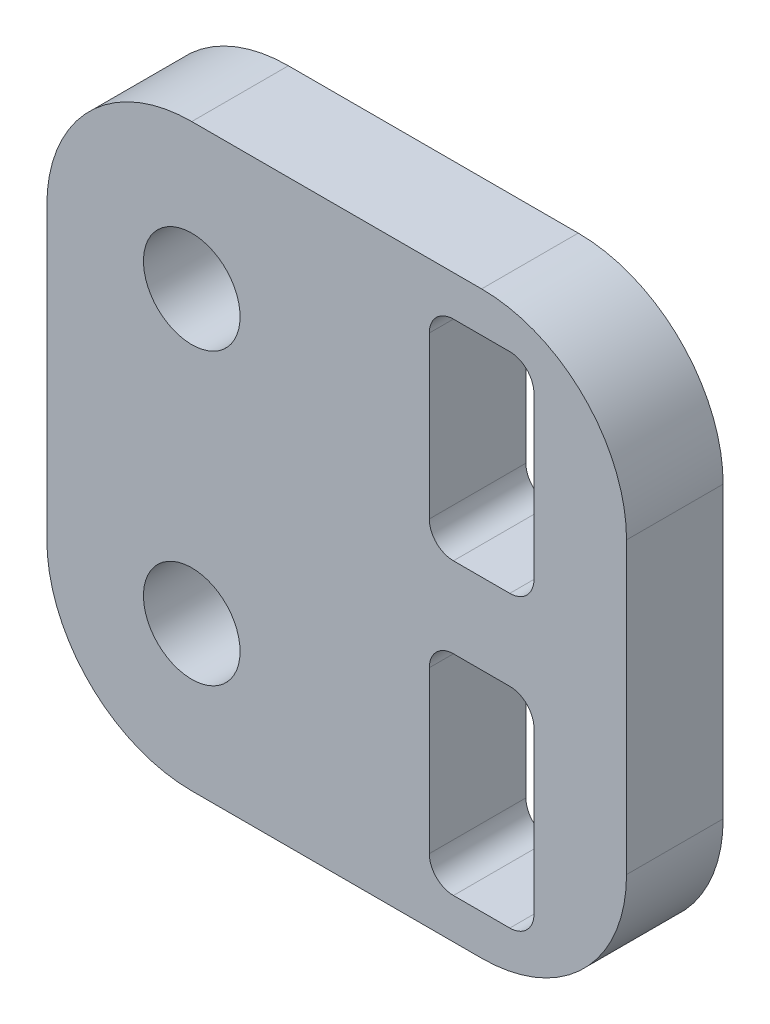
ISO-10303-21;
HEADER;
FILE_DESCRIPTION(('STEP AP214'),'2;1');
FILE_NAME('part.step','',(''),(''),'','','');
FILE_SCHEMA(('AUTOMOTIVE_DESIGN { 1 0 10303 214 1 1 1 1 }'));
ENDSEC;
DATA;
#1=APPLICATION_CONTEXT('core data for automotive mechanical design processes');
#2=APPLICATION_PROTOCOL_DEFINITION('international standard','automotive_design',2000,#1);
#3=PRODUCT_CONTEXT('',#1,'mechanical');
#4=PRODUCT('Part','Part','',(#3));
#5=PRODUCT_RELATED_PRODUCT_CATEGORY('part','',(#4));
#6=PRODUCT_DEFINITION_FORMATION('','',#4);
#7=PRODUCT_DEFINITION_CONTEXT('part definition',#1,'design');
#8=PRODUCT_DEFINITION('design','',#6,#7);
#9=PRODUCT_DEFINITION_SHAPE('','',#8);
#10=(LENGTH_UNIT() NAMED_UNIT(*) SI_UNIT(.MILLI.,.METRE.));
#11=(NAMED_UNIT(*) PLANE_ANGLE_UNIT() SI_UNIT($,.RADIAN.));
#12=(NAMED_UNIT(*) SI_UNIT($,.STERADIAN.) SOLID_ANGLE_UNIT());
#13=UNCERTAINTY_MEASURE_WITH_UNIT(LENGTH_MEASURE(1.E-05),#10,'distance_accuracy_value','');
#14=(GEOMETRIC_REPRESENTATION_CONTEXT(3) GLOBAL_UNCERTAINTY_ASSIGNED_CONTEXT((#13)) GLOBAL_UNIT_ASSIGNED_CONTEXT((#10,
#11,#12)) REPRESENTATION_CONTEXT('',''));
#15=CARTESIAN_POINT('',(0.,0.,0.));
#16=DIRECTION('',(0.,0.,1.));
#17=DIRECTION('',(1.,0.,0.));
#18=AXIS2_PLACEMENT_3D('',#15,#16,#17);
#19=CARTESIAN_POINT('',(204.3359221937,165.8331963046,3.));
#20=DIRECTION('',(0.,0.,1.));
#21=DIRECTION('',(1.,0.,0.));
#22=AXIS2_PLACEMENT_3D('',#19,#20,#21);
#23=PLANE('',#22);
#24=DIRECTION('',(0.,-1.,0.));
#25=VECTOR('',#24,1.);
#26=CARTESIAN_POINT('',(202.7109221937,172.3331963046,3.));
#27=LINE('',#26,#25);
#28=CARTESIAN_POINT('',(202.7109221937,177.3331963046,3.));
#29=VERTEX_POINT('',#28);
#30=CARTESIAN_POINT('',(202.7109221937,172.3331963046,3.));
#31=VERTEX_POINT('',#30);
#32=EDGE_CURVE('E260',#29,#31,#27,.T.);
#33=ORIENTED_EDGE('',*,*,#32,.F.);
#34=CARTESIAN_POINT('',(203.4609221937,177.3331963046,3.));
#35=DIRECTION('',(0.,0.,1.));
#36=DIRECTION('',(1.,0.,0.));
#37=AXIS2_PLACEMENT_3D('',#34,#35,#36);
#38=CIRCLE('',#37,0.750000000000001);
#39=CARTESIAN_POINT('',(203.4609221937,178.0831963046,3.));
#40=VERTEX_POINT('',#39);
#41=EDGE_CURVE('E258',#40,#29,#38,.T.);
#42=ORIENTED_EDGE('',*,*,#41,.F.);
#43=DIRECTION('',(-1.,0.,0.));
#44=VECTOR('',#43,1.);
#45=CARTESIAN_POINT('',(203.4609221937,178.0831963046,3.));
#46=LINE('',#45,#44);
#47=CARTESIAN_POINT('',(205.2109221937,178.0831963046,3.));
#48=VERTEX_POINT('',#47);
#49=EDGE_CURVE('E274',#48,#40,#46,.T.);
#50=ORIENTED_EDGE('',*,*,#49,.F.);
#51=CARTESIAN_POINT('',(205.2109221937,177.3331963046,3.));
#52=DIRECTION('',(0.,0.,1.));
#53=DIRECTION('',(1.,0.,0.));
#54=AXIS2_PLACEMENT_3D('',#51,#52,#53);
#55=CIRCLE('',#54,0.750000000000001);
#56=CARTESIAN_POINT('',(205.9609221937,177.3331963046,3.));
#57=VERTEX_POINT('',#56);
#58=EDGE_CURVE('E271',#57,#48,#55,.T.);
#59=ORIENTED_EDGE('',*,*,#58,.F.);
#60=DIRECTION('',(0.,1.,0.));
#61=VECTOR('',#60,1.);
#62=CARTESIAN_POINT('',(205.9609221937,177.3331963046,3.));
#63=LINE('',#62,#61);
#64=CARTESIAN_POINT('',(205.9609221937,172.3331963046,3.));
#65=VERTEX_POINT('',#64);
#66=EDGE_CURVE('E269',#65,#57,#63,.T.);
#67=ORIENTED_EDGE('',*,*,#66,.F.);
#68=CARTESIAN_POINT('',(205.2109221937,172.3331963046,3.));
#69=DIRECTION('',(0.,0.,1.));
#70=DIRECTION('',(1.,0.,0.));
#71=AXIS2_PLACEMENT_3D('',#68,#69,#70);
#72=CIRCLE('',#71,0.750000000000001);
#73=CARTESIAN_POINT('',(205.2109221937,171.5831963046,3.));
#74=VERTEX_POINT('',#73);
#75=EDGE_CURVE('E267',#74,#65,#72,.T.);
#76=ORIENTED_EDGE('',*,*,#75,.F.);
#77=DIRECTION('',(1.,0.,0.));
#78=VECTOR('',#77,1.);
#79=CARTESIAN_POINT('',(205.2109221937,171.5831963046,3.));
#80=LINE('',#79,#78);
#81=CARTESIAN_POINT('',(203.4609221937,171.5831963046,3.));
#82=VERTEX_POINT('',#81);
#83=EDGE_CURVE('E265',#82,#74,#80,.T.);
#84=ORIENTED_EDGE('',*,*,#83,.F.);
#85=CARTESIAN_POINT('',(203.4609221937,172.3331963046,3.));
#86=DIRECTION('',(0.,0.,1.));
#87=DIRECTION('',(1.,0.,0.));
#88=AXIS2_PLACEMENT_3D('',#85,#86,#87);
#89=CIRCLE('',#88,0.750000000000001);
#90=EDGE_CURVE('E263',#31,#82,#89,.T.);
#91=ORIENTED_EDGE('',*,*,#90,.F.);
#92=EDGE_LOOP('',(#33,#42,#50,#59,#67,#76,#84,#91));
#93=FACE_BOUND('',#92,.T.);
#94=CARTESIAN_POINT('',(195.3359221937,174.8331963046,3.));
#95=DIRECTION('',(0.,0.,1.));
#96=DIRECTION('',(1.,0.,0.));
#97=AXIS2_PLACEMENT_3D('',#94,#95,#96);
#98=CIRCLE('',#97,1.5);
#99=CARTESIAN_POINT('',(196.8359221937,174.8331963046,3.));
#100=VERTEX_POINT('',#99);
#101=EDGE_CURVE('E323',#100,#100,#98,.T.);
#102=ORIENTED_EDGE('',*,*,#101,.F.);
#103=EDGE_LOOP('',(#102));
#104=FACE_BOUND('',#103,.T.);
#105=CARTESIAN_POINT('',(204.3359221937,165.8331963046,3.));
#106=DIRECTION('',(0.,0.,1.));
#107=DIRECTION('',(1.,0.,0.));
#108=AXIS2_PLACEMENT_3D('',#105,#106,#107);
#109=CIRCLE('',#108,4.49999999999999);
#110=CARTESIAN_POINT('',(204.3359221937,161.3331963046,3.));
#111=VERTEX_POINT('',#110);
#112=CARTESIAN_POINT('',(208.8359221937,165.8331963046,3.));
#113=VERTEX_POINT('',#112);
#114=EDGE_CURVE('E329',#111,#113,#109,.T.);
#115=ORIENTED_EDGE('',*,*,#114,.T.);
#116=DIRECTION('',(0.,1.,0.));
#117=VECTOR('',#116,1.);
#118=CARTESIAN_POINT('',(208.8359221937,165.8331963046,3.));
#119=LINE('',#118,#117);
#120=CARTESIAN_POINT('',(208.8359221937,174.8331963046,3.));
#121=VERTEX_POINT('',#120);
#122=EDGE_CURVE('E332',#113,#121,#119,.T.);
#123=ORIENTED_EDGE('',*,*,#122,.T.);
#124=CARTESIAN_POINT('',(204.3359221937,174.8331963046,3.));
#125=DIRECTION('',(0.,0.,1.));
#126=DIRECTION('',(1.,0.,0.));
#127=AXIS2_PLACEMENT_3D('',#124,#125,#126);
#128=CIRCLE('',#127,4.49999999999998);
#129=CARTESIAN_POINT('',(204.3359221937,179.3331963046,3.));
#130=VERTEX_POINT('',#129);
#131=EDGE_CURVE('E335',#121,#130,#128,.T.);
#132=ORIENTED_EDGE('',*,*,#131,.T.);
#133=DIRECTION('',(-1.,0.,0.));
#134=VECTOR('',#133,1.);
#135=CARTESIAN_POINT('',(204.3359221937,179.3331963046,3.));
#136=LINE('',#135,#134);
#137=CARTESIAN_POINT('',(195.3359221937,179.3331963046,3.));
#138=VERTEX_POINT('',#137);
#139=EDGE_CURVE('E337',#130,#138,#136,.T.);
#140=ORIENTED_EDGE('',*,*,#139,.T.);
#141=CARTESIAN_POINT('',(195.3359221937,174.8331963046,3.));
#142=DIRECTION('',(0.,0.,1.));
#143=DIRECTION('',(1.,0.,0.));
#144=AXIS2_PLACEMENT_3D('',#141,#142,#143);
#145=CIRCLE('',#144,4.49999999999999);
#146=CARTESIAN_POINT('',(190.8359221937,174.8331963046,3.));
#147=VERTEX_POINT('',#146);
#148=EDGE_CURVE('E339',#138,#147,#145,.T.);
#149=ORIENTED_EDGE('',*,*,#148,.T.);
#150=DIRECTION('',(0.,-1.,0.));
#151=VECTOR('',#150,1.);
#152=CARTESIAN_POINT('',(190.8359221937,174.8331963046,3.));
#153=LINE('',#152,#151);
#154=CARTESIAN_POINT('',(190.8359221937,165.8331963046,3.));
#155=VERTEX_POINT('',#154);
#156=EDGE_CURVE('E341',#147,#155,#153,.T.);
#157=ORIENTED_EDGE('',*,*,#156,.T.);
#158=CARTESIAN_POINT('',(195.3359221937,165.8331963046,3.));
#159=DIRECTION('',(0.,0.,1.));
#160=DIRECTION('',(1.,0.,0.));
#161=AXIS2_PLACEMENT_3D('',#158,#159,#160);
#162=CIRCLE('',#161,4.5);
#163=CARTESIAN_POINT('',(195.3359221937,161.3331963046,3.));
#164=VERTEX_POINT('',#163);
#165=EDGE_CURVE('E343',#155,#164,#162,.T.);
#166=ORIENTED_EDGE('',*,*,#165,.T.);
#167=DIRECTION('',(1.,0.,0.));
#168=VECTOR('',#167,1.);
#169=CARTESIAN_POINT('',(195.3359221937,161.3331963046,3.));
#170=LINE('',#169,#168);
#171=EDGE_CURVE('E345',#164,#111,#170,.T.);
#172=ORIENTED_EDGE('',*,*,#171,.T.);
#173=EDGE_LOOP('',(#115,#123,#132,#140,#149,#157,#166,#172));
#174=FACE_BOUND('',#173,.T.);
#175=CARTESIAN_POINT('',(195.3359221937,165.8331963046,3.));
#176=DIRECTION('',(0.,0.,1.));
#177=DIRECTION('',(1.,0.,0.));
#178=AXIS2_PLACEMENT_3D('',#175,#176,#177);
#179=CIRCLE('',#178,1.5);
#180=CARTESIAN_POINT('',(196.8359221937,165.8331963046,3.));
#181=VERTEX_POINT('',#180);
#182=EDGE_CURVE('E317',#181,#181,#179,.T.);
#183=ORIENTED_EDGE('',*,*,#182,.F.);
#184=EDGE_LOOP('',(#183));
#185=FACE_BOUND('',#184,.T.);
#186=DIRECTION('',(0.,1.,0.));
#187=VECTOR('',#186,1.);
#188=CARTESIAN_POINT('',(205.9609221937,168.3331963046,3.));
#189=LINE('',#188,#187);
#190=CARTESIAN_POINT('',(205.9609221937,163.3331963046,3.));
#191=VERTEX_POINT('',#190);
#192=CARTESIAN_POINT('',(205.9609221937,168.3331963046,3.));
#193=VERTEX_POINT('',#192);
#194=EDGE_CURVE('E201',#191,#193,#189,.T.);
#195=ORIENTED_EDGE('',*,*,#194,.F.);
#196=CARTESIAN_POINT('',(205.2109221937,163.3331963046,3.));
#197=DIRECTION('',(0.,0.,1.));
#198=DIRECTION('',(1.,0.,0.));
#199=AXIS2_PLACEMENT_3D('',#196,#197,#198);
#200=CIRCLE('',#199,0.750000000000001);
#201=CARTESIAN_POINT('',(205.2109221937,162.5831963046,3.));
#202=VERTEX_POINT('',#201);
#203=EDGE_CURVE('E193',#202,#191,#200,.T.);
#204=ORIENTED_EDGE('',*,*,#203,.F.);
#205=DIRECTION('',(1.,0.,0.));
#206=VECTOR('',#205,1.);
#207=CARTESIAN_POINT('',(205.2109221937,162.5831963046,3.));
#208=LINE('',#207,#206);
#209=CARTESIAN_POINT('',(203.4609221937,162.5831963046,3.));
#210=VERTEX_POINT('',#209);
#211=EDGE_CURVE('E226',#210,#202,#208,.T.);
#212=ORIENTED_EDGE('',*,*,#211,.F.);
#213=CARTESIAN_POINT('',(203.4609221937,163.3331963046,3.));
#214=DIRECTION('',(0.,0.,1.));
#215=DIRECTION('',(1.,0.,0.));
#216=AXIS2_PLACEMENT_3D('',#213,#214,#215);
#217=CIRCLE('',#216,0.750000000000001);
#218=CARTESIAN_POINT('',(202.7109221937,163.3331963046,3.));
#219=VERTEX_POINT('',#218);
#220=EDGE_CURVE('E224',#219,#210,#217,.T.);
#221=ORIENTED_EDGE('',*,*,#220,.F.);
#222=DIRECTION('',(0.,-1.,0.));
#223=VECTOR('',#222,1.);
#224=CARTESIAN_POINT('',(202.7109221937,163.3331963046,3.));
#225=LINE('',#224,#223);
#226=CARTESIAN_POINT('',(202.7109221937,168.3331963046,3.));
#227=VERTEX_POINT('',#226);
#228=EDGE_CURVE('E222',#227,#219,#225,.T.);
#229=ORIENTED_EDGE('',*,*,#228,.F.);
#230=CARTESIAN_POINT('',(203.4609221937,168.3331963046,3.));
#231=DIRECTION('',(0.,0.,1.));
#232=DIRECTION('',(1.,0.,0.));
#233=AXIS2_PLACEMENT_3D('',#230,#231,#232);
#234=CIRCLE('',#233,0.750000000000001);
#235=CARTESIAN_POINT('',(203.4609221937,169.0831963046,3.));
#236=VERTEX_POINT('',#235);
#237=EDGE_CURVE('E220',#236,#227,#234,.T.);
#238=ORIENTED_EDGE('',*,*,#237,.F.);
#239=DIRECTION('',(-1.,0.,0.));
#240=VECTOR('',#239,1.);
#241=CARTESIAN_POINT('',(203.4609221937,169.0831963046,3.));
#242=LINE('',#241,#240);
#243=CARTESIAN_POINT('',(205.2109221937,169.0831963046,3.));
#244=VERTEX_POINT('',#243);
#245=EDGE_CURVE('E216',#244,#236,#242,.T.);
#246=ORIENTED_EDGE('',*,*,#245,.F.);
#247=CARTESIAN_POINT('',(205.2109221937,168.3331963046,3.));
#248=DIRECTION('',(0.,0.,1.));
#249=DIRECTION('',(1.,0.,0.));
#250=AXIS2_PLACEMENT_3D('',#247,#248,#249);
#251=CIRCLE('',#250,0.750000000000001);
#252=EDGE_CURVE('E214',#193,#244,#251,.T.);
#253=ORIENTED_EDGE('',*,*,#252,.F.);
#254=EDGE_LOOP('',(#195,#204,#212,#221,#229,#238,#246,#253));
#255=FACE_BOUND('',#254,.T.);
#256=ADVANCED_FACE('F32',(#93,#104,#174,#185,#255),#23,.T.);
#257=CARTESIAN_POINT('',(204.3359221937,165.8331963046,0.));
#258=DIRECTION('',(0.,0.,1.));
#259=DIRECTION('',(1.,0.,0.));
#260=AXIS2_PLACEMENT_3D('',#257,#258,#259);
#261=PLANE('',#260);
#262=CARTESIAN_POINT('',(203.4609221937,177.3331963046,0.));
#263=DIRECTION('',(0.,0.,1.));
#264=DIRECTION('',(1.,0.,0.));
#265=AXIS2_PLACEMENT_3D('',#262,#263,#264);
#266=CIRCLE('',#265,0.750000000000001);
#267=CARTESIAN_POINT('',(203.4609221937,178.0831963046,0.));
#268=VERTEX_POINT('',#267);
#269=CARTESIAN_POINT('',(202.7109221937,177.3331963046,0.));
#270=VERTEX_POINT('',#269);
#271=EDGE_CURVE('E209',#268,#270,#266,.T.);
#272=ORIENTED_EDGE('',*,*,#271,.T.);
#273=DIRECTION('',(0.,-1.,0.));
#274=VECTOR('',#273,1.);
#275=CARTESIAN_POINT('',(202.7109221937,172.3331963046,0.));
#276=LINE('',#275,#274);
#277=CARTESIAN_POINT('',(202.7109221937,172.3331963046,0.));
#278=VERTEX_POINT('',#277);
#279=EDGE_CURVE('E279',#270,#278,#276,.T.);
#280=ORIENTED_EDGE('',*,*,#279,.T.);
#281=CARTESIAN_POINT('',(203.4609221937,172.3331963046,0.));
#282=DIRECTION('',(0.,0.,1.));
#283=DIRECTION('',(1.,0.,0.));
#284=AXIS2_PLACEMENT_3D('',#281,#282,#283);
#285=CIRCLE('',#284,0.750000000000001);
#286=CARTESIAN_POINT('',(203.4609221937,171.5831963046,0.));
#287=VERTEX_POINT('',#286);
#288=EDGE_CURVE('E282',#278,#287,#285,.T.);
#289=ORIENTED_EDGE('',*,*,#288,.T.);
#290=DIRECTION('',(1.,0.,0.));
#291=VECTOR('',#290,1.);
#292=CARTESIAN_POINT('',(205.2109221937,171.5831963046,0.));
#293=LINE('',#292,#291);
#294=CARTESIAN_POINT('',(205.2109221937,171.5831963046,0.));
#295=VERTEX_POINT('',#294);
#296=EDGE_CURVE('E285',#287,#295,#293,.T.);
#297=ORIENTED_EDGE('',*,*,#296,.T.);
#298=CARTESIAN_POINT('',(205.2109221937,172.3331963046,0.));
#299=DIRECTION('',(0.,0.,1.));
#300=DIRECTION('',(1.,0.,0.));
#301=AXIS2_PLACEMENT_3D('',#298,#299,#300);
#302=CIRCLE('',#301,0.750000000000001);
#303=CARTESIAN_POINT('',(205.9609221937,172.3331963046,0.));
#304=VERTEX_POINT('',#303);
#305=EDGE_CURVE('E288',#295,#304,#302,.T.);
#306=ORIENTED_EDGE('',*,*,#305,.T.);
#307=DIRECTION('',(0.,1.,0.));
#308=VECTOR('',#307,1.);
#309=CARTESIAN_POINT('',(205.9609221937,177.3331963046,0.));
#310=LINE('',#309,#308);
#311=CARTESIAN_POINT('',(205.9609221937,177.3331963046,0.));
#312=VERTEX_POINT('',#311);
#313=EDGE_CURVE('E291',#304,#312,#310,.T.);
#314=ORIENTED_EDGE('',*,*,#313,.T.);
#315=CARTESIAN_POINT('',(205.2109221937,177.3331963046,0.));
#316=DIRECTION('',(0.,0.,1.));
#317=DIRECTION('',(1.,0.,0.));
#318=AXIS2_PLACEMENT_3D('',#315,#316,#317);
#319=CIRCLE('',#318,0.750000000000001);
#320=CARTESIAN_POINT('',(205.2109221937,178.0831963046,0.));
#321=VERTEX_POINT('',#320);
#322=EDGE_CURVE('E294',#312,#321,#319,.T.);
#323=ORIENTED_EDGE('',*,*,#322,.T.);
#324=DIRECTION('',(-1.,0.,0.));
#325=VECTOR('',#324,1.);
#326=CARTESIAN_POINT('',(203.4609221937,178.0831963046,0.));
#327=LINE('',#326,#325);
#328=EDGE_CURVE('E261',#321,#268,#327,.T.);
#329=ORIENTED_EDGE('',*,*,#328,.T.);
#330=EDGE_LOOP('',(#272,#280,#289,#297,#306,#314,#323,#329));
#331=FACE_BOUND('',#330,.T.);
#332=CARTESIAN_POINT('',(195.3359221937,174.8331963046,0.));
#333=DIRECTION('',(0.,0.,1.));
#334=DIRECTION('',(1.,0.,0.));
#335=AXIS2_PLACEMENT_3D('',#332,#333,#334);
#336=CIRCLE('',#335,1.5);
#337=CARTESIAN_POINT('',(196.8359221937,174.8331963046,0.));
#338=VERTEX_POINT('',#337);
#339=EDGE_CURVE('E320',#338,#338,#336,.T.);
#340=ORIENTED_EDGE('',*,*,#339,.T.);
#341=EDGE_LOOP('',(#340));
#342=FACE_BOUND('',#341,.T.);
#343=CARTESIAN_POINT('',(204.3359221937,165.8331963046,0.));
#344=DIRECTION('',(0.,0.,1.));
#345=DIRECTION('',(1.,0.,0.));
#346=AXIS2_PLACEMENT_3D('',#343,#344,#345);
#347=CIRCLE('',#346,4.49999999999999);
#348=CARTESIAN_POINT('',(204.3359221937,161.3331963046,0.));
#349=VERTEX_POINT('',#348);
#350=CARTESIAN_POINT('',(208.8359221937,165.8331963046,0.));
#351=VERTEX_POINT('',#350);
#352=EDGE_CURVE('E326',#349,#351,#347,.T.);
#353=ORIENTED_EDGE('',*,*,#352,.F.);
#354=DIRECTION('',(1.,0.,0.));
#355=VECTOR('',#354,1.);
#356=CARTESIAN_POINT('',(195.3359221937,161.3331963046,0.));
#357=LINE('',#356,#355);
#358=CARTESIAN_POINT('',(195.3359221937,161.3331963046,0.));
#359=VERTEX_POINT('',#358);
#360=EDGE_CURVE('E333',#359,#349,#357,.T.);
#361=ORIENTED_EDGE('',*,*,#360,.F.);
#362=CARTESIAN_POINT('',(195.3359221937,165.8331963046,0.));
#363=DIRECTION('',(0.,0.,1.));
#364=DIRECTION('',(1.,0.,0.));
#365=AXIS2_PLACEMENT_3D('',#362,#363,#364);
#366=CIRCLE('',#365,4.5);
#367=CARTESIAN_POINT('',(190.8359221937,165.8331963046,0.));
#368=VERTEX_POINT('',#367);
#369=EDGE_CURVE('E360',#368,#359,#366,.T.);
#370=ORIENTED_EDGE('',*,*,#369,.F.);
#371=DIRECTION('',(0.,-1.,0.));
#372=VECTOR('',#371,1.);
#373=CARTESIAN_POINT('',(190.8359221937,174.8331963046,0.));
#374=LINE('',#373,#372);
#375=CARTESIAN_POINT('',(190.8359221937,174.8331963046,0.));
#376=VERTEX_POINT('',#375);
#377=EDGE_CURVE('E358',#376,#368,#374,.T.);
#378=ORIENTED_EDGE('',*,*,#377,.F.);
#379=CARTESIAN_POINT('',(195.3359221937,174.8331963046,0.));
#380=DIRECTION('',(0.,0.,1.));
#381=DIRECTION('',(1.,0.,0.));
#382=AXIS2_PLACEMENT_3D('',#379,#380,#381);
#383=CIRCLE('',#382,4.49999999999999);
#384=CARTESIAN_POINT('',(195.3359221937,179.3331963046,0.));
#385=VERTEX_POINT('',#384);
#386=EDGE_CURVE('E356',#385,#376,#383,.T.);
#387=ORIENTED_EDGE('',*,*,#386,.F.);
#388=DIRECTION('',(-1.,0.,0.));
#389=VECTOR('',#388,1.);
#390=CARTESIAN_POINT('',(204.3359221937,179.3331963046,0.));
#391=LINE('',#390,#389);
#392=CARTESIAN_POINT('',(204.3359221937,179.3331963046,0.));
#393=VERTEX_POINT('',#392);
#394=EDGE_CURVE('E354',#393,#385,#391,.T.);
#395=ORIENTED_EDGE('',*,*,#394,.F.);
#396=CARTESIAN_POINT('',(204.3359221937,174.8331963046,0.));
#397=DIRECTION('',(0.,0.,1.));
#398=DIRECTION('',(1.,0.,0.));
#399=AXIS2_PLACEMENT_3D('',#396,#397,#398);
#400=CIRCLE('',#399,4.49999999999998);
#401=CARTESIAN_POINT('',(208.8359221937,174.8331963046,0.));
#402=VERTEX_POINT('',#401);
#403=EDGE_CURVE('E352',#402,#393,#400,.T.);
#404=ORIENTED_EDGE('',*,*,#403,.F.);
#405=DIRECTION('',(0.,1.,0.));
#406=VECTOR('',#405,1.);
#407=CARTESIAN_POINT('',(208.8359221937,165.8331963046,0.));
#408=LINE('',#407,#406);
#409=EDGE_CURVE('E350',#351,#402,#408,.T.);
#410=ORIENTED_EDGE('',*,*,#409,.F.);
#411=EDGE_LOOP('',(#353,#361,#370,#378,#387,#395,#404,#410));
#412=FACE_BOUND('',#411,.T.);
#413=CARTESIAN_POINT('',(195.3359221937,165.8331963046,0.));
#414=DIRECTION('',(0.,0.,1.));
#415=DIRECTION('',(1.,0.,0.));
#416=AXIS2_PLACEMENT_3D('',#413,#414,#415);
#417=CIRCLE('',#416,1.5);
#418=CARTESIAN_POINT('',(196.8359221937,165.8331963046,0.));
#419=VERTEX_POINT('',#418);
#420=EDGE_CURVE('E316',#419,#419,#417,.T.);
#421=ORIENTED_EDGE('',*,*,#420,.T.);
#422=EDGE_LOOP('',(#421));
#423=FACE_BOUND('',#422,.T.);
#424=CARTESIAN_POINT('',(205.2109221937,163.3331963046,0.));
#425=DIRECTION('',(0.,0.,1.));
#426=DIRECTION('',(1.,0.,0.));
#427=AXIS2_PLACEMENT_3D('',#424,#425,#426);
#428=CIRCLE('',#427,0.750000000000001);
#429=CARTESIAN_POINT('',(205.2109221937,162.5831963046,0.));
#430=VERTEX_POINT('',#429);
#431=CARTESIAN_POINT('',(205.9609221937,163.3331963046,0.));
#432=VERTEX_POINT('',#431);
#433=EDGE_CURVE('E55',#430,#432,#428,.T.);
#434=ORIENTED_EDGE('',*,*,#433,.T.);
#435=DIRECTION('',(0.,1.,0.));
#436=VECTOR('',#435,1.);
#437=CARTESIAN_POINT('',(205.9609221937,168.3331963046,0.));
#438=LINE('',#437,#436);
#439=CARTESIAN_POINT('',(205.9609221937,168.3331963046,0.));
#440=VERTEX_POINT('',#439);
#441=EDGE_CURVE('E208',#432,#440,#438,.T.);
#442=ORIENTED_EDGE('',*,*,#441,.T.);
#443=CARTESIAN_POINT('',(205.2109221937,168.3331963046,0.));
#444=DIRECTION('',(0.,0.,1.));
#445=DIRECTION('',(1.,0.,0.));
#446=AXIS2_PLACEMENT_3D('',#443,#444,#445);
#447=CIRCLE('',#446,0.750000000000001);
#448=CARTESIAN_POINT('',(205.2109221937,169.0831963046,0.));
#449=VERTEX_POINT('',#448);
#450=EDGE_CURVE('E230',#440,#449,#447,.T.);
#451=ORIENTED_EDGE('',*,*,#450,.T.);
#452=DIRECTION('',(-1.,0.,0.));
#453=VECTOR('',#452,1.);
#454=CARTESIAN_POINT('',(203.4609221937,169.0831963046,0.));
#455=LINE('',#454,#453);
#456=CARTESIAN_POINT('',(203.4609221937,169.0831963046,0.));
#457=VERTEX_POINT('',#456);
#458=EDGE_CURVE('E233',#449,#457,#455,.T.);
#459=ORIENTED_EDGE('',*,*,#458,.T.);
#460=CARTESIAN_POINT('',(203.4609221937,168.3331963046,0.));
#461=DIRECTION('',(0.,0.,1.));
#462=DIRECTION('',(1.,0.,0.));
#463=AXIS2_PLACEMENT_3D('',#460,#461,#462);
#464=CIRCLE('',#463,0.750000000000001);
#465=CARTESIAN_POINT('',(202.7109221937,168.3331963046,0.));
#466=VERTEX_POINT('',#465);
#467=EDGE_CURVE('E236',#457,#466,#464,.T.);
#468=ORIENTED_EDGE('',*,*,#467,.T.);
#469=DIRECTION('',(0.,-1.,0.));
#470=VECTOR('',#469,1.);
#471=CARTESIAN_POINT('',(202.7109221937,163.3331963046,0.));
#472=LINE('',#471,#470);
#473=CARTESIAN_POINT('',(202.7109221937,163.3331963046,0.));
#474=VERTEX_POINT('',#473);
#475=EDGE_CURVE('E239',#466,#474,#472,.T.);
#476=ORIENTED_EDGE('',*,*,#475,.T.);
#477=CARTESIAN_POINT('',(203.4609221937,163.3331963046,0.));
#478=DIRECTION('',(0.,0.,1.));
#479=DIRECTION('',(1.,0.,0.));
#480=AXIS2_PLACEMENT_3D('',#477,#478,#479);
#481=CIRCLE('',#480,0.750000000000001);
#482=CARTESIAN_POINT('',(203.4609221937,162.5831963046,0.));
#483=VERTEX_POINT('',#482);
#484=EDGE_CURVE('E242',#474,#483,#481,.T.);
#485=ORIENTED_EDGE('',*,*,#484,.T.);
#486=DIRECTION('',(1.,0.,0.));
#487=VECTOR('',#486,1.);
#488=CARTESIAN_POINT('',(205.2109221937,162.5831963046,0.));
#489=LINE('',#488,#487);
#490=EDGE_CURVE('E202',#483,#430,#489,.T.);
#491=ORIENTED_EDGE('',*,*,#490,.T.);
#492=EDGE_LOOP('',(#434,#442,#451,#459,#468,#476,#485,#491));
#493=FACE_BOUND('',#492,.T.);
#494=ADVANCED_FACE('F390',(#331,#342,#412,#423,#493),#261,.F.);
#495=CARTESIAN_POINT('',(204.3359221937,165.8331963046,3.));
#496=DIRECTION('',(0.,0.,-1.));
#497=DIRECTION('',(-1.,0.,0.));
#498=AXIS2_PLACEMENT_3D('',#495,#496,#497);
#499=CYLINDRICAL_SURFACE('',#498,4.49999999999999);
#500=ORIENTED_EDGE('',*,*,#352,.T.);
#501=DIRECTION('',(0.,0.,-1.));
#502=VECTOR('',#501,1.);
#503=CARTESIAN_POINT('',(208.8359221937,165.8331963046,3.));
#504=LINE('',#503,#502);
#505=EDGE_CURVE('E11',#113,#351,#504,.T.);
#506=ORIENTED_EDGE('',*,*,#505,.F.);
#507=ORIENTED_EDGE('',*,*,#114,.F.);
#508=DIRECTION('',(0.,0.,-1.));
#509=VECTOR('',#508,1.);
#510=CARTESIAN_POINT('',(204.3359221937,161.3331963046,3.));
#511=LINE('',#510,#509);
#512=EDGE_CURVE('E347',#111,#349,#511,.T.);
#513=ORIENTED_EDGE('',*,*,#512,.T.);
#514=EDGE_LOOP('',(#500,#506,#507,#513));
#515=FACE_BOUND('',#514,.T.);
#516=ADVANCED_FACE('F34',(#515),#499,.T.);
#517=CARTESIAN_POINT('',(208.8359221937,165.8331963046,3.));
#518=DIRECTION('',(-1.,0.,0.));
#519=DIRECTION('',(0.,0.,1.));
#520=AXIS2_PLACEMENT_3D('',#517,#518,#519);
#521=PLANE('',#520);
#522=ORIENTED_EDGE('',*,*,#409,.T.);
#523=DIRECTION('',(0.,0.,-1.));
#524=VECTOR('',#523,1.);
#525=CARTESIAN_POINT('',(208.8359221937,174.8331963046,3.));
#526=LINE('',#525,#524);
#527=EDGE_CURVE('E40',#121,#402,#526,.T.);
#528=ORIENTED_EDGE('',*,*,#527,.F.);
#529=ORIENTED_EDGE('',*,*,#122,.F.);
#530=ORIENTED_EDGE('',*,*,#505,.T.);
#531=EDGE_LOOP('',(#522,#528,#529,#530));
#532=FACE_BOUND('',#531,.T.);
#533=ADVANCED_FACE('F408',(#532),#521,.F.);
#534=CARTESIAN_POINT('',(204.3359221937,174.8331963046,3.));
#535=DIRECTION('',(0.,0.,-1.));
#536=DIRECTION('',(-1.,0.,0.));
#537=AXIS2_PLACEMENT_3D('',#534,#535,#536);
#538=CYLINDRICAL_SURFACE('',#537,4.49999999999998);
#539=ORIENTED_EDGE('',*,*,#403,.T.);
#540=DIRECTION('',(0.,0.,-1.));
#541=VECTOR('',#540,1.);
#542=CARTESIAN_POINT('',(204.3359221937,179.3331963046,3.));
#543=LINE('',#542,#541);
#544=EDGE_CURVE('E377',#130,#393,#543,.T.);
#545=ORIENTED_EDGE('',*,*,#544,.F.);
#546=ORIENTED_EDGE('',*,*,#131,.F.);
#547=ORIENTED_EDGE('',*,*,#527,.T.);
#548=EDGE_LOOP('',(#539,#545,#546,#547));
#549=FACE_BOUND('',#548,.T.);
#550=ADVANCED_FACE('F384',(#549),#538,.T.);
#551=CARTESIAN_POINT('',(204.3359221937,179.3331963046,3.));
#552=DIRECTION('',(0.,-1.,0.));
#553=DIRECTION('',(0.,0.,-1.));
#554=AXIS2_PLACEMENT_3D('',#551,#552,#553);
#555=PLANE('',#554);
#556=ORIENTED_EDGE('',*,*,#394,.T.);
#557=DIRECTION('',(0.,0.,-1.));
#558=VECTOR('',#557,1.);
#559=CARTESIAN_POINT('',(195.3359221937,179.3331963046,3.));
#560=LINE('',#559,#558);
#561=EDGE_CURVE('E374',#138,#385,#560,.T.);
#562=ORIENTED_EDGE('',*,*,#561,.F.);
#563=ORIENTED_EDGE('',*,*,#139,.F.);
#564=ORIENTED_EDGE('',*,*,#544,.T.);
#565=EDGE_LOOP('',(#556,#562,#563,#564));
#566=FACE_BOUND('',#565,.T.);
#567=ADVANCED_FACE('F396',(#566),#555,.F.);
#568=CARTESIAN_POINT('',(195.3359221937,174.8331963046,3.));
#569=DIRECTION('',(0.,0.,-1.));
#570=DIRECTION('',(-1.,0.,0.));
#571=AXIS2_PLACEMENT_3D('',#568,#569,#570);
#572=CYLINDRICAL_SURFACE('',#571,4.49999999999999);
#573=ORIENTED_EDGE('',*,*,#386,.T.);
#574=DIRECTION('',(0.,0.,-1.));
#575=VECTOR('',#574,1.);
#576=CARTESIAN_POINT('',(190.8359221937,174.8331963046,3.));
#577=LINE('',#576,#575);
#578=EDGE_CURVE('E371',#147,#376,#577,.T.);
#579=ORIENTED_EDGE('',*,*,#578,.F.);
#580=ORIENTED_EDGE('',*,*,#148,.F.);
#581=ORIENTED_EDGE('',*,*,#561,.T.);
#582=EDGE_LOOP('',(#573,#579,#580,#581));
#583=FACE_BOUND('',#582,.T.);
#584=ADVANCED_FACE('F400',(#583),#572,.T.);
#585=CARTESIAN_POINT('',(190.8359221937,174.8331963046,3.));
#586=DIRECTION('',(1.,0.,0.));
#587=DIRECTION('',(0.,0.,-1.));
#588=AXIS2_PLACEMENT_3D('',#585,#586,#587);
#589=PLANE('',#588);
#590=ORIENTED_EDGE('',*,*,#377,.T.);
#591=DIRECTION('',(0.,0.,-1.));
#592=VECTOR('',#591,1.);
#593=CARTESIAN_POINT('',(190.8359221937,165.8331963046,3.));
#594=LINE('',#593,#592);
#595=EDGE_CURVE('E368',#155,#368,#594,.T.);
#596=ORIENTED_EDGE('',*,*,#595,.F.);
#597=ORIENTED_EDGE('',*,*,#156,.F.);
#598=ORIENTED_EDGE('',*,*,#578,.T.);
#599=EDGE_LOOP('',(#590,#596,#597,#598));
#600=FACE_BOUND('',#599,.T.);
#601=ADVANCED_FACE('F421',(#600),#589,.F.);
#602=CARTESIAN_POINT('',(195.3359221937,165.8331963046,3.));
#603=DIRECTION('',(0.,0.,-1.));
#604=DIRECTION('',(-1.,0.,0.));
#605=AXIS2_PLACEMENT_3D('',#602,#603,#604);
#606=CYLINDRICAL_SURFACE('',#605,4.5);
#607=ORIENTED_EDGE('',*,*,#369,.T.);
#608=DIRECTION('',(0.,0.,-1.));
#609=VECTOR('',#608,1.);
#610=CARTESIAN_POINT('',(195.3359221937,161.3331963046,3.));
#611=LINE('',#610,#609);
#612=EDGE_CURVE('E365',#164,#359,#611,.T.);
#613=ORIENTED_EDGE('',*,*,#612,.F.);
#614=ORIENTED_EDGE('',*,*,#165,.F.);
#615=ORIENTED_EDGE('',*,*,#595,.T.);
#616=EDGE_LOOP('',(#607,#613,#614,#615));
#617=FACE_BOUND('',#616,.T.);
#618=ADVANCED_FACE('F419',(#617),#606,.T.);
#619=CARTESIAN_POINT('',(195.3359221937,161.3331963046,3.));
#620=DIRECTION('',(0.,1.,0.));
#621=DIRECTION('',(0.,0.,1.));
#622=AXIS2_PLACEMENT_3D('',#619,#620,#621);
#623=PLANE('',#622);
#624=ORIENTED_EDGE('',*,*,#360,.T.);
#625=ORIENTED_EDGE('',*,*,#512,.F.);
#626=ORIENTED_EDGE('',*,*,#171,.F.);
#627=ORIENTED_EDGE('',*,*,#612,.T.);
#628=EDGE_LOOP('',(#624,#625,#626,#627));
#629=FACE_BOUND('',#628,.T.);
#630=ADVANCED_FACE('F414',(#629),#623,.F.);
#631=CARTESIAN_POINT('',(195.3359221937,174.8331963046,3.));
#632=DIRECTION('',(0.,0.,-1.));
#633=DIRECTION('',(-1.,0.,0.));
#634=AXIS2_PLACEMENT_3D('',#631,#632,#633);
#635=CYLINDRICAL_SURFACE('',#634,1.5);
#636=ORIENTED_EDGE('',*,*,#101,.T.);
#637=EDGE_LOOP('',(#636));
#638=FACE_BOUND('',#637,.T.);
#639=ORIENTED_EDGE('',*,*,#339,.F.);
#640=EDGE_LOOP('',(#639));
#641=FACE_BOUND('',#640,.T.);
#642=ADVANCED_FACE('F441',(#638,#641),#635,.F.);
#643=CARTESIAN_POINT('',(195.3359221937,165.8331963046,3.));
#644=DIRECTION('',(0.,0.,-1.));
#645=DIRECTION('',(-1.,0.,0.));
#646=AXIS2_PLACEMENT_3D('',#643,#644,#645);
#647=CYLINDRICAL_SURFACE('',#646,1.5);
#648=ORIENTED_EDGE('',*,*,#182,.T.);
#649=EDGE_LOOP('',(#648));
#650=FACE_BOUND('',#649,.T.);
#651=ORIENTED_EDGE('',*,*,#420,.F.);
#652=EDGE_LOOP('',(#651));
#653=FACE_BOUND('',#652,.T.);
#654=ADVANCED_FACE('F448',(#650,#653),#647,.F.);
#655=CARTESIAN_POINT('',(203.4609221937,177.3331963046,3.));
#656=DIRECTION('',(0.,0.,-1.));
#657=DIRECTION('',(-1.,0.,0.));
#658=AXIS2_PLACEMENT_3D('',#655,#656,#657);
#659=CYLINDRICAL_SURFACE('',#658,0.750000000000001);
#660=ORIENTED_EDGE('',*,*,#271,.F.);
#661=DIRECTION('',(0.,0.,-1.));
#662=VECTOR('',#661,1.);
#663=CARTESIAN_POINT('',(203.4609221937,178.0831963046,3.));
#664=LINE('',#663,#662);
#665=EDGE_CURVE('E276',#40,#268,#664,.T.);
#666=ORIENTED_EDGE('',*,*,#665,.F.);
#667=ORIENTED_EDGE('',*,*,#41,.T.);
#668=DIRECTION('',(0.,0.,-1.));
#669=VECTOR('',#668,1.);
#670=CARTESIAN_POINT('',(202.7109221937,177.3331963046,3.));
#671=LINE('',#670,#669);
#672=EDGE_CURVE('E313',#29,#270,#671,.T.);
#673=ORIENTED_EDGE('',*,*,#672,.T.);
#674=EDGE_LOOP('',(#660,#666,#667,#673));
#675=FACE_BOUND('',#674,.T.);
#676=ADVANCED_FACE('F453',(#675),#659,.F.);
#677=CARTESIAN_POINT('',(202.7109221937,172.3331963046,3.));
#678=DIRECTION('',(1.,0.,0.));
#679=DIRECTION('',(0.,0.,-1.));
#680=AXIS2_PLACEMENT_3D('',#677,#678,#679);
#681=PLANE('',#680);
#682=ORIENTED_EDGE('',*,*,#279,.F.);
#683=ORIENTED_EDGE('',*,*,#672,.F.);
#684=ORIENTED_EDGE('',*,*,#32,.T.);
#685=DIRECTION('',(0.,0.,-1.));
#686=VECTOR('',#685,1.);
#687=CARTESIAN_POINT('',(202.7109221937,172.3331963046,3.));
#688=LINE('',#687,#686);
#689=EDGE_CURVE('E311',#31,#278,#688,.T.);
#690=ORIENTED_EDGE('',*,*,#689,.T.);
#691=EDGE_LOOP('',(#682,#683,#684,#690));
#692=FACE_BOUND('',#691,.T.);
#693=ADVANCED_FACE('F462',(#692),#681,.T.);
#694=CARTESIAN_POINT('',(203.4609221937,172.3331963046,3.));
#695=DIRECTION('',(0.,0.,-1.));
#696=DIRECTION('',(-1.,0.,0.));
#697=AXIS2_PLACEMENT_3D('',#694,#695,#696);
#698=CYLINDRICAL_SURFACE('',#697,0.750000000000001);
#699=ORIENTED_EDGE('',*,*,#288,.F.);
#700=ORIENTED_EDGE('',*,*,#689,.F.);
#701=ORIENTED_EDGE('',*,*,#90,.T.);
#702=DIRECTION('',(0.,0.,-1.));
#703=VECTOR('',#702,1.);
#704=CARTESIAN_POINT('',(203.4609221937,171.5831963046,3.));
#705=LINE('',#704,#703);
#706=EDGE_CURVE('E309',#82,#287,#705,.T.);
#707=ORIENTED_EDGE('',*,*,#706,.T.);
#708=EDGE_LOOP('',(#699,#700,#701,#707));
#709=FACE_BOUND('',#708,.T.);
#710=ADVANCED_FACE('F469',(#709),#698,.F.);
#711=CARTESIAN_POINT('',(205.2109221937,171.5831963046,3.));
#712=DIRECTION('',(0.,1.,0.));
#713=DIRECTION('',(0.,0.,1.));
#714=AXIS2_PLACEMENT_3D('',#711,#712,#713);
#715=PLANE('',#714);
#716=ORIENTED_EDGE('',*,*,#296,.F.);
#717=ORIENTED_EDGE('',*,*,#706,.F.);
#718=ORIENTED_EDGE('',*,*,#83,.T.);
#719=DIRECTION('',(0.,0.,-1.));
#720=VECTOR('',#719,1.);
#721=CARTESIAN_POINT('',(205.2109221937,171.5831963046,3.));
#722=LINE('',#721,#720);
#723=EDGE_CURVE('E307',#74,#295,#722,.T.);
#724=ORIENTED_EDGE('',*,*,#723,.T.);
#725=EDGE_LOOP('',(#716,#717,#718,#724));
#726=FACE_BOUND('',#725,.T.);
#727=ADVANCED_FACE('F473',(#726),#715,.T.);
#728=CARTESIAN_POINT('',(205.2109221937,172.3331963046,3.));
#729=DIRECTION('',(0.,0.,-1.));
#730=DIRECTION('',(-1.,0.,0.));
#731=AXIS2_PLACEMENT_3D('',#728,#729,#730);
#732=CYLINDRICAL_SURFACE('',#731,0.750000000000001);
#733=ORIENTED_EDGE('',*,*,#305,.F.);
#734=ORIENTED_EDGE('',*,*,#723,.F.);
#735=ORIENTED_EDGE('',*,*,#75,.T.);
#736=DIRECTION('',(0.,0.,-1.));
#737=VECTOR('',#736,1.);
#738=CARTESIAN_POINT('',(205.9609221937,172.3331963046,3.));
#739=LINE('',#738,#737);
#740=EDGE_CURVE('E305',#65,#304,#739,.T.);
#741=ORIENTED_EDGE('',*,*,#740,.T.);
#742=EDGE_LOOP('',(#733,#734,#735,#741));
#743=FACE_BOUND('',#742,.T.);
#744=ADVANCED_FACE('F477',(#743),#732,.F.);
#745=CARTESIAN_POINT('',(205.9609221937,177.3331963046,3.));
#746=DIRECTION('',(-1.,0.,0.));
#747=DIRECTION('',(0.,0.,1.));
#748=AXIS2_PLACEMENT_3D('',#745,#746,#747);
#749=PLANE('',#748);
#750=ORIENTED_EDGE('',*,*,#313,.F.);
#751=ORIENTED_EDGE('',*,*,#740,.F.);
#752=ORIENTED_EDGE('',*,*,#66,.T.);
#753=DIRECTION('',(0.,0.,-1.));
#754=VECTOR('',#753,1.);
#755=CARTESIAN_POINT('',(205.9609221937,177.3331963046,3.));
#756=LINE('',#755,#754);
#757=EDGE_CURVE('E303',#57,#312,#756,.T.);
#758=ORIENTED_EDGE('',*,*,#757,.T.);
#759=EDGE_LOOP('',(#750,#751,#752,#758));
#760=FACE_BOUND('',#759,.T.);
#761=ADVANCED_FACE('F481',(#760),#749,.T.);
#762=CARTESIAN_POINT('',(205.2109221937,177.3331963046,3.));
#763=DIRECTION('',(0.,0.,-1.));
#764=DIRECTION('',(-1.,0.,0.));
#765=AXIS2_PLACEMENT_3D('',#762,#763,#764);
#766=CYLINDRICAL_SURFACE('',#765,0.750000000000001);
#767=ORIENTED_EDGE('',*,*,#322,.F.);
#768=ORIENTED_EDGE('',*,*,#757,.F.);
#769=ORIENTED_EDGE('',*,*,#58,.T.);
#770=DIRECTION('',(0.,0.,-1.));
#771=VECTOR('',#770,1.);
#772=CARTESIAN_POINT('',(205.2109221937,178.0831963046,3.));
#773=LINE('',#772,#771);
#774=EDGE_CURVE('E301',#48,#321,#773,.T.);
#775=ORIENTED_EDGE('',*,*,#774,.T.);
#776=EDGE_LOOP('',(#767,#768,#769,#775));
#777=FACE_BOUND('',#776,.T.);
#778=ADVANCED_FACE('F485',(#777),#766,.F.);
#779=CARTESIAN_POINT('',(203.4609221937,178.0831963046,3.));
#780=DIRECTION('',(0.,-1.,0.));
#781=DIRECTION('',(0.,0.,-1.));
#782=AXIS2_PLACEMENT_3D('',#779,#780,#781);
#783=PLANE('',#782);
#784=ORIENTED_EDGE('',*,*,#328,.F.);
#785=ORIENTED_EDGE('',*,*,#774,.F.);
#786=ORIENTED_EDGE('',*,*,#49,.T.);
#787=ORIENTED_EDGE('',*,*,#665,.T.);
#788=EDGE_LOOP('',(#784,#785,#786,#787));
#789=FACE_BOUND('',#788,.T.);
#790=ADVANCED_FACE('F489',(#789),#783,.T.);
#791=CARTESIAN_POINT('',(205.2109221937,163.3331963046,3.));
#792=DIRECTION('',(0.,0.,-1.));
#793=DIRECTION('',(-1.,0.,0.));
#794=AXIS2_PLACEMENT_3D('',#791,#792,#793);
#795=CYLINDRICAL_SURFACE('',#794,0.750000000000001);
#796=ORIENTED_EDGE('',*,*,#433,.F.);
#797=DIRECTION('',(0.,0.,-1.));
#798=VECTOR('',#797,1.);
#799=CARTESIAN_POINT('',(205.2109221937,162.5831963046,3.));
#800=LINE('',#799,#798);
#801=EDGE_CURVE('E197',#202,#430,#800,.T.);
#802=ORIENTED_EDGE('',*,*,#801,.F.);
#803=ORIENTED_EDGE('',*,*,#203,.T.);
#804=DIRECTION('',(0.,0.,-1.));
#805=VECTOR('',#804,1.);
#806=CARTESIAN_POINT('',(205.9609221937,163.3331963046,3.));
#807=LINE('',#806,#805);
#808=EDGE_CURVE('E196',#191,#432,#807,.T.);
#809=ORIENTED_EDGE('',*,*,#808,.T.);
#810=EDGE_LOOP('',(#796,#802,#803,#809));
#811=FACE_BOUND('',#810,.T.);
#812=ADVANCED_FACE('F195',(#811),#795,.F.);
#813=CARTESIAN_POINT('',(205.9609221937,168.3331963046,3.));
#814=DIRECTION('',(-1.,0.,0.));
#815=DIRECTION('',(0.,0.,1.));
#816=AXIS2_PLACEMENT_3D('',#813,#814,#815);
#817=PLANE('',#816);
#818=ORIENTED_EDGE('',*,*,#441,.F.);
#819=ORIENTED_EDGE('',*,*,#808,.F.);
#820=ORIENTED_EDGE('',*,*,#194,.T.);
#821=DIRECTION('',(0.,0.,-1.));
#822=VECTOR('',#821,1.);
#823=CARTESIAN_POINT('',(205.9609221937,168.3331963046,3.));
#824=LINE('',#823,#822);
#825=EDGE_CURVE('E210',#193,#440,#824,.T.);
#826=ORIENTED_EDGE('',*,*,#825,.T.);
#827=EDGE_LOOP('',(#818,#819,#820,#826));
#828=FACE_BOUND('',#827,.T.);
#829=ADVANCED_FACE('F205',(#828),#817,.T.);
#830=CARTESIAN_POINT('',(205.2109221937,168.3331963046,3.));
#831=DIRECTION('',(0.,0.,-1.));
#832=DIRECTION('',(-1.,0.,0.));
#833=AXIS2_PLACEMENT_3D('',#830,#831,#832);
#834=CYLINDRICAL_SURFACE('',#833,0.750000000000001);
#835=ORIENTED_EDGE('',*,*,#450,.F.);
#836=ORIENTED_EDGE('',*,*,#825,.F.);
#837=ORIENTED_EDGE('',*,*,#252,.T.);
#838=DIRECTION('',(0.,0.,-1.));
#839=VECTOR('',#838,1.);
#840=CARTESIAN_POINT('',(205.2109221937,169.0831963046,3.));
#841=LINE('',#840,#839);
#842=EDGE_CURVE('E255',#244,#449,#841,.T.);
#843=ORIENTED_EDGE('',*,*,#842,.T.);
#844=EDGE_LOOP('',(#835,#836,#837,#843));
#845=FACE_BOUND('',#844,.T.);
#846=ADVANCED_FACE('F498',(#845),#834,.F.);
#847=CARTESIAN_POINT('',(203.4609221937,169.0831963046,3.));
#848=DIRECTION('',(0.,-1.,0.));
#849=DIRECTION('',(0.,0.,-1.));
#850=AXIS2_PLACEMENT_3D('',#847,#848,#849);
#851=PLANE('',#850);
#852=ORIENTED_EDGE('',*,*,#458,.F.);
#853=ORIENTED_EDGE('',*,*,#842,.F.);
#854=ORIENTED_EDGE('',*,*,#245,.T.);
#855=DIRECTION('',(0.,0.,-1.));
#856=VECTOR('',#855,1.);
#857=CARTESIAN_POINT('',(203.4609221937,169.0831963046,3.));
#858=LINE('',#857,#856);
#859=EDGE_CURVE('E253',#236,#457,#858,.T.);
#860=ORIENTED_EDGE('',*,*,#859,.T.);
#861=EDGE_LOOP('',(#852,#853,#854,#860));
#862=FACE_BOUND('',#861,.T.);
#863=ADVANCED_FACE('F501',(#862),#851,.T.);
#864=CARTESIAN_POINT('',(203.4609221937,168.3331963046,3.));
#865=DIRECTION('',(0.,0.,-1.));
#866=DIRECTION('',(-1.,0.,0.));
#867=AXIS2_PLACEMENT_3D('',#864,#865,#866);
#868=CYLINDRICAL_SURFACE('',#867,0.750000000000001);
#869=ORIENTED_EDGE('',*,*,#467,.F.);
#870=ORIENTED_EDGE('',*,*,#859,.F.);
#871=ORIENTED_EDGE('',*,*,#237,.T.);
#872=DIRECTION('',(0.,0.,-1.));
#873=VECTOR('',#872,1.);
#874=CARTESIAN_POINT('',(202.7109221937,168.3331963046,3.));
#875=LINE('',#874,#873);
#876=EDGE_CURVE('E251',#227,#466,#875,.T.);
#877=ORIENTED_EDGE('',*,*,#876,.T.);
#878=EDGE_LOOP('',(#869,#870,#871,#877));
#879=FACE_BOUND('',#878,.T.);
#880=ADVANCED_FACE('F505',(#879),#868,.F.);
#881=CARTESIAN_POINT('',(202.7109221937,163.3331963046,3.));
#882=DIRECTION('',(1.,0.,0.));
#883=DIRECTION('',(0.,0.,-1.));
#884=AXIS2_PLACEMENT_3D('',#881,#882,#883);
#885=PLANE('',#884);
#886=ORIENTED_EDGE('',*,*,#475,.F.);
#887=ORIENTED_EDGE('',*,*,#876,.F.);
#888=ORIENTED_EDGE('',*,*,#228,.T.);
#889=DIRECTION('',(0.,0.,-1.));
#890=VECTOR('',#889,1.);
#891=CARTESIAN_POINT('',(202.7109221937,163.3331963046,3.));
#892=LINE('',#891,#890);
#893=EDGE_CURVE('E249',#219,#474,#892,.T.);
#894=ORIENTED_EDGE('',*,*,#893,.T.);
#895=EDGE_LOOP('',(#886,#887,#888,#894));
#896=FACE_BOUND('',#895,.T.);
#897=ADVANCED_FACE('F509',(#896),#885,.T.);
#898=CARTESIAN_POINT('',(203.4609221937,163.3331963046,3.));
#899=DIRECTION('',(0.,0.,-1.));
#900=DIRECTION('',(-1.,0.,0.));
#901=AXIS2_PLACEMENT_3D('',#898,#899,#900);
#902=CYLINDRICAL_SURFACE('',#901,0.750000000000001);
#903=ORIENTED_EDGE('',*,*,#484,.F.);
#904=ORIENTED_EDGE('',*,*,#893,.F.);
#905=ORIENTED_EDGE('',*,*,#220,.T.);
#906=DIRECTION('',(0.,0.,-1.));
#907=VECTOR('',#906,1.);
#908=CARTESIAN_POINT('',(203.4609221937,162.5831963046,3.));
#909=LINE('',#908,#907);
#910=EDGE_CURVE('E47',#210,#483,#909,.T.);
#911=ORIENTED_EDGE('',*,*,#910,.T.);
#912=EDGE_LOOP('',(#903,#904,#905,#911));
#913=FACE_BOUND('',#912,.T.);
#914=ADVANCED_FACE('F513',(#913),#902,.F.);
#915=CARTESIAN_POINT('',(205.2109221937,162.5831963046,3.));
#916=DIRECTION('',(0.,1.,0.));
#917=DIRECTION('',(0.,0.,1.));
#918=AXIS2_PLACEMENT_3D('',#915,#916,#917);
#919=PLANE('',#918);
#920=ORIENTED_EDGE('',*,*,#490,.F.);
#921=ORIENTED_EDGE('',*,*,#910,.F.);
#922=ORIENTED_EDGE('',*,*,#211,.T.);
#923=ORIENTED_EDGE('',*,*,#801,.T.);
#924=EDGE_LOOP('',(#920,#921,#922,#923));
#925=FACE_BOUND('',#924,.T.);
#926=ADVANCED_FACE('F517',(#925),#919,.T.);
#927=CLOSED_SHELL('',(#256,#494,#516,#533,#550,#567,#584,#601,#618,#630,#642,#654,#676,#693,
#710,#727,#744,#761,#778,#790,#812,#829,#846,#863,#880,#897,#914,#926));
#928=MANIFOLD_SOLID_BREP('B2',#927);
#929=ADVANCED_BREP_SHAPE_REPRESENTATION('',(#18,#928),#14);
#930=SHAPE_DEFINITION_REPRESENTATION(#9,#929);
ENDSEC;
END-ISO-10303-21;
